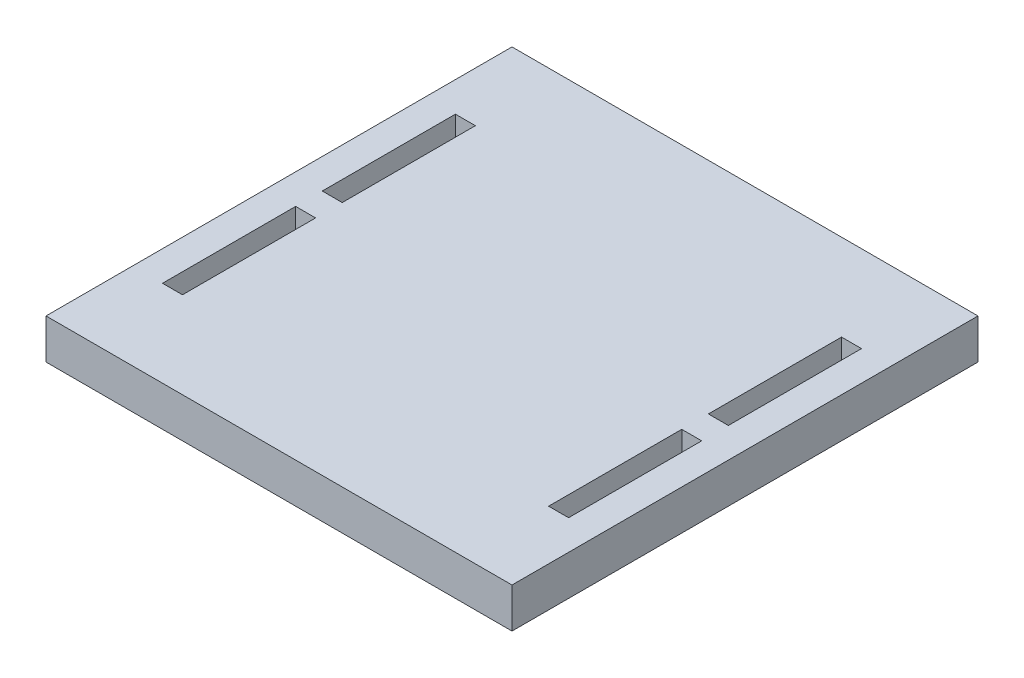
ISO-10303-21;
HEADER;
FILE_DESCRIPTION(('STEP AP214'),'2;1');
FILE_NAME('part.step','',(''),(''),'','','');
FILE_SCHEMA(('AUTOMOTIVE_DESIGN { 1 0 10303 214 1 1 1 1 }'));
ENDSEC;
DATA;
#1=APPLICATION_CONTEXT('core data for automotive mechanical design processes');
#2=APPLICATION_PROTOCOL_DEFINITION('international standard','automotive_design',2000,#1);
#3=PRODUCT_CONTEXT('',#1,'mechanical');
#4=PRODUCT('Part','Part','',(#3));
#5=PRODUCT_RELATED_PRODUCT_CATEGORY('part','',(#4));
#6=PRODUCT_DEFINITION_FORMATION('','',#4);
#7=PRODUCT_DEFINITION_CONTEXT('part definition',#1,'design');
#8=PRODUCT_DEFINITION('design','',#6,#7);
#9=PRODUCT_DEFINITION_SHAPE('','',#8);
#10=(LENGTH_UNIT() NAMED_UNIT(*) SI_UNIT(.MILLI.,.METRE.));
#11=(NAMED_UNIT(*) PLANE_ANGLE_UNIT() SI_UNIT($,.RADIAN.));
#12=(NAMED_UNIT(*) SI_UNIT($,.STERADIAN.) SOLID_ANGLE_UNIT());
#13=UNCERTAINTY_MEASURE_WITH_UNIT(LENGTH_MEASURE(1.E-05),#10,'distance_accuracy_value','');
#14=(GEOMETRIC_REPRESENTATION_CONTEXT(3) GLOBAL_UNCERTAINTY_ASSIGNED_CONTEXT((#13)) GLOBAL_UNIT_ASSIGNED_CONTEXT((#10,
#11,#12)) REPRESENTATION_CONTEXT('',''));
#15=CARTESIAN_POINT('',(0.,0.,0.));
#16=DIRECTION('',(0.,0.,1.));
#17=DIRECTION('',(1.,0.,0.));
#18=AXIS2_PLACEMENT_3D('',#15,#16,#17);
#19=CARTESIAN_POINT('',(0.,6.,37.));
#20=DIRECTION('',(0.,0.,1.));
#21=DIRECTION('',(1.,0.,0.));
#22=AXIS2_PLACEMENT_3D('',#19,#20,#21);
#23=PLANE('',#22);
#24=DIRECTION('',(-1.,0.,0.));
#25=VECTOR('',#24,1.);
#26=CARTESIAN_POINT('',(0.,0.,37.));
#27=LINE('',#26,#25);
#28=CARTESIAN_POINT('',(65.5,0.,37.));
#29=VERTEX_POINT('',#28);
#30=CARTESIAN_POINT('',(62.5,0.,37.));
#31=VERTEX_POINT('',#30);
#32=EDGE_CURVE('E289',#29,#31,#27,.T.);
#33=ORIENTED_EDGE('',*,*,#32,.F.);
#34=DIRECTION('',(0.,-1.,0.));
#35=VECTOR('',#34,1.);
#36=CARTESIAN_POINT('',(65.5,6.,37.));
#37=LINE('',#36,#35);
#38=CARTESIAN_POINT('',(65.5,6.,37.));
#39=VERTEX_POINT('',#38);
#40=EDGE_CURVE('E11',#39,#29,#37,.T.);
#41=ORIENTED_EDGE('',*,*,#40,.F.);
#42=DIRECTION('',(-1.,0.,0.));
#43=VECTOR('',#42,1.);
#44=CARTESIAN_POINT('',(0.,6.,37.));
#45=LINE('',#44,#43);
#46=CARTESIAN_POINT('',(62.5,6.,37.));
#47=VERTEX_POINT('',#46);
#48=EDGE_CURVE('E215',#39,#47,#45,.T.);
#49=ORIENTED_EDGE('',*,*,#48,.T.);
#50=DIRECTION('',(0.,-1.,0.));
#51=VECTOR('',#50,1.);
#52=CARTESIAN_POINT('',(62.5,6.,37.));
#53=LINE('',#52,#51);
#54=EDGE_CURVE('E138',#47,#31,#53,.T.);
#55=ORIENTED_EDGE('',*,*,#54,.T.);
#56=EDGE_LOOP('',(#33,#41,#49,#55));
#57=FACE_BOUND('',#56,.T.);
#58=ADVANCED_FACE('F47',(#57),#23,.T.);
#59=CARTESIAN_POINT('',(65.5,6.,0.));
#60=DIRECTION('',(-1.,0.,0.));
#61=DIRECTION('',(0.,0.,1.));
#62=AXIS2_PLACEMENT_3D('',#59,#60,#61);
#63=PLANE('',#62);
#64=DIRECTION('',(0.,0.,-1.));
#65=VECTOR('',#64,1.);
#66=CARTESIAN_POINT('',(65.5,0.,0.));
#67=LINE('',#66,#65);
#68=CARTESIAN_POINT('',(65.5,0.,57.));
#69=VERTEX_POINT('',#68);
#70=EDGE_CURVE('E203',#69,#29,#67,.T.);
#71=ORIENTED_EDGE('',*,*,#70,.F.);
#72=DIRECTION('',(0.,-1.,0.));
#73=VECTOR('',#72,1.);
#74=CARTESIAN_POINT('',(65.5,6.,57.));
#75=LINE('',#74,#73);
#76=CARTESIAN_POINT('',(65.5,6.,57.));
#77=VERTEX_POINT('',#76);
#78=EDGE_CURVE('E58',#77,#69,#75,.T.);
#79=ORIENTED_EDGE('',*,*,#78,.F.);
#80=DIRECTION('',(0.,0.,-1.));
#81=VECTOR('',#80,1.);
#82=CARTESIAN_POINT('',(65.5,6.,0.));
#83=LINE('',#82,#81);
#84=EDGE_CURVE('E201',#77,#39,#83,.T.);
#85=ORIENTED_EDGE('',*,*,#84,.T.);
#86=ORIENTED_EDGE('',*,*,#40,.T.);
#87=EDGE_LOOP('',(#71,#79,#85,#86));
#88=FACE_BOUND('',#87,.T.);
#89=ADVANCED_FACE('F199',(#88),#63,.T.);
#90=CARTESIAN_POINT('',(0.,6.,57.));
#91=DIRECTION('',(0.,0.,1.));
#92=DIRECTION('',(1.,0.,0.));
#93=AXIS2_PLACEMENT_3D('',#90,#91,#92);
#94=PLANE('',#93);
#95=DIRECTION('',(-1.,0.,0.));
#96=VECTOR('',#95,1.);
#97=CARTESIAN_POINT('',(0.,0.,57.));
#98=LINE('',#97,#96);
#99=CARTESIAN_POINT('',(62.5,0.,57.));
#100=VERTEX_POINT('',#99);
#101=EDGE_CURVE('E294',#69,#100,#98,.T.);
#102=ORIENTED_EDGE('',*,*,#101,.T.);
#103=DIRECTION('',(0.,-1.,0.));
#104=VECTOR('',#103,1.);
#105=CARTESIAN_POINT('',(62.5,6.,57.));
#106=LINE('',#105,#104);
#107=CARTESIAN_POINT('',(62.5,6.,57.));
#108=VERTEX_POINT('',#107);
#109=EDGE_CURVE('E207',#108,#100,#106,.T.);
#110=ORIENTED_EDGE('',*,*,#109,.F.);
#111=DIRECTION('',(-1.,0.,0.));
#112=VECTOR('',#111,1.);
#113=CARTESIAN_POINT('',(0.,6.,57.));
#114=LINE('',#113,#112);
#115=EDGE_CURVE('E210',#77,#108,#114,.T.);
#116=ORIENTED_EDGE('',*,*,#115,.F.);
#117=ORIENTED_EDGE('',*,*,#78,.T.);
#118=EDGE_LOOP('',(#102,#110,#116,#117));
#119=FACE_BOUND('',#118,.T.);
#120=ADVANCED_FACE('F211',(#119),#94,.F.);
#121=CARTESIAN_POINT('',(0.,6.,57.));
#122=DIRECTION('',(0.,0.,-1.));
#123=DIRECTION('',(-1.,0.,0.));
#124=AXIS2_PLACEMENT_3D('',#121,#122,#123);
#125=PLANE('',#124);
#126=DIRECTION('',(1.,0.,0.));
#127=VECTOR('',#126,1.);
#128=CARTESIAN_POINT('',(0.,0.,57.));
#129=LINE('',#128,#127);
#130=CARTESIAN_POINT('',(4.5,0.,57.));
#131=VERTEX_POINT('',#130);
#132=CARTESIAN_POINT('',(7.50000000000001,0.,57.));
#133=VERTEX_POINT('',#132);
#134=EDGE_CURVE('E273',#131,#133,#129,.T.);
#135=ORIENTED_EDGE('',*,*,#134,.F.);
#136=DIRECTION('',(0.,-1.,0.));
#137=VECTOR('',#136,1.);
#138=CARTESIAN_POINT('',(4.5,6.,57.));
#139=LINE('',#138,#137);
#140=CARTESIAN_POINT('',(4.5,6.,57.));
#141=VERTEX_POINT('',#140);
#142=EDGE_CURVE('E301',#141,#131,#139,.T.);
#143=ORIENTED_EDGE('',*,*,#142,.F.);
#144=DIRECTION('',(1.,0.,0.));
#145=VECTOR('',#144,1.);
#146=CARTESIAN_POINT('',(0.,6.,57.));
#147=LINE('',#146,#145);
#148=CARTESIAN_POINT('',(7.50000000000001,6.,57.));
#149=VERTEX_POINT('',#148);
#150=EDGE_CURVE('E411',#141,#149,#147,.T.);
#151=ORIENTED_EDGE('',*,*,#150,.T.);
#152=DIRECTION('',(0.,-1.,0.));
#153=VECTOR('',#152,1.);
#154=CARTESIAN_POINT('',(7.50000000000001,6.,57.));
#155=LINE('',#154,#153);
#156=EDGE_CURVE('E304',#149,#133,#155,.T.);
#157=ORIENTED_EDGE('',*,*,#156,.T.);
#158=EDGE_LOOP('',(#135,#143,#151,#157));
#159=FACE_BOUND('',#158,.T.);
#160=ADVANCED_FACE('F438',(#159),#125,.T.);
#161=CARTESIAN_POINT('',(4.50000000000001,6.,0.));
#162=DIRECTION('',(-1.,0.,0.));
#163=DIRECTION('',(0.,0.,1.));
#164=AXIS2_PLACEMENT_3D('',#161,#162,#163);
#165=PLANE('',#164);
#166=DIRECTION('',(0.,0.,-1.));
#167=VECTOR('',#166,1.);
#168=CARTESIAN_POINT('',(4.50000000000001,0.,0.));
#169=LINE('',#168,#167);
#170=CARTESIAN_POINT('',(4.50000000000001,0.,37.));
#171=VERTEX_POINT('',#170);
#172=EDGE_CURVE('E277',#131,#171,#169,.T.);
#173=ORIENTED_EDGE('',*,*,#172,.T.);
#174=DIRECTION('',(0.,-1.,0.));
#175=VECTOR('',#174,1.);
#176=CARTESIAN_POINT('',(4.50000000000001,6.,37.));
#177=LINE('',#176,#175);
#178=CARTESIAN_POINT('',(4.50000000000001,6.,37.));
#179=VERTEX_POINT('',#178);
#180=EDGE_CURVE('E311',#179,#171,#177,.T.);
#181=ORIENTED_EDGE('',*,*,#180,.F.);
#182=DIRECTION('',(0.,0.,-1.));
#183=VECTOR('',#182,1.);
#184=CARTESIAN_POINT('',(4.50000000000001,6.,0.));
#185=LINE('',#184,#183);
#186=EDGE_CURVE('E415',#141,#179,#185,.T.);
#187=ORIENTED_EDGE('',*,*,#186,.F.);
#188=ORIENTED_EDGE('',*,*,#142,.T.);
#189=EDGE_LOOP('',(#173,#181,#187,#188));
#190=FACE_BOUND('',#189,.T.);
#191=ADVANCED_FACE('F440',(#190),#165,.F.);
#192=CARTESIAN_POINT('',(0.,6.,37.));
#193=DIRECTION('',(0.,0.,-1.));
#194=DIRECTION('',(-1.,0.,0.));
#195=AXIS2_PLACEMENT_3D('',#192,#193,#194);
#196=PLANE('',#195);
#197=DIRECTION('',(1.,0.,0.));
#198=VECTOR('',#197,1.);
#199=CARTESIAN_POINT('',(0.,0.,37.));
#200=LINE('',#199,#198);
#201=CARTESIAN_POINT('',(7.50000000000001,0.,37.));
#202=VERTEX_POINT('',#201);
#203=EDGE_CURVE('E281',#171,#202,#200,.T.);
#204=ORIENTED_EDGE('',*,*,#203,.T.);
#205=DIRECTION('',(0.,-1.,0.));
#206=VECTOR('',#205,1.);
#207=CARTESIAN_POINT('',(7.50000000000001,6.,37.));
#208=LINE('',#207,#206);
#209=CARTESIAN_POINT('',(7.50000000000001,6.,37.));
#210=VERTEX_POINT('',#209);
#211=EDGE_CURVE('E307',#210,#202,#208,.T.);
#212=ORIENTED_EDGE('',*,*,#211,.F.);
#213=DIRECTION('',(1.,0.,0.));
#214=VECTOR('',#213,1.);
#215=CARTESIAN_POINT('',(0.,6.,37.));
#216=LINE('',#215,#214);
#217=EDGE_CURVE('E419',#179,#210,#216,.T.);
#218=ORIENTED_EDGE('',*,*,#217,.F.);
#219=ORIENTED_EDGE('',*,*,#180,.T.);
#220=EDGE_LOOP('',(#204,#212,#218,#219));
#221=FACE_BOUND('',#220,.T.);
#222=ADVANCED_FACE('F433',(#221),#196,.F.);
#223=CARTESIAN_POINT('',(0.,6.,13.));
#224=DIRECTION('',(0.,0.,1.));
#225=DIRECTION('',(1.,0.,0.));
#226=AXIS2_PLACEMENT_3D('',#223,#224,#225);
#227=PLANE('',#226);
#228=DIRECTION('',(-1.,0.,0.));
#229=VECTOR('',#228,1.);
#230=CARTESIAN_POINT('',(0.,0.,13.));
#231=LINE('',#230,#229);
#232=CARTESIAN_POINT('',(65.5,0.,13.));
#233=VERTEX_POINT('',#232);
#234=CARTESIAN_POINT('',(62.5,0.,13.));
#235=VERTEX_POINT('',#234);
#236=EDGE_CURVE('E257',#233,#235,#231,.T.);
#237=ORIENTED_EDGE('',*,*,#236,.F.);
#238=DIRECTION('',(0.,-1.,0.));
#239=VECTOR('',#238,1.);
#240=CARTESIAN_POINT('',(65.5,6.,13.));
#241=LINE('',#240,#239);
#242=CARTESIAN_POINT('',(65.5,6.,13.));
#243=VERTEX_POINT('',#242);
#244=EDGE_CURVE('E308',#243,#233,#241,.T.);
#245=ORIENTED_EDGE('',*,*,#244,.F.);
#246=DIRECTION('',(-1.,0.,0.));
#247=VECTOR('',#246,1.);
#248=CARTESIAN_POINT('',(0.,6.,13.));
#249=LINE('',#248,#247);
#250=CARTESIAN_POINT('',(62.5,6.,13.));
#251=VERTEX_POINT('',#250);
#252=EDGE_CURVE('E396',#243,#251,#249,.T.);
#253=ORIENTED_EDGE('',*,*,#252,.T.);
#254=DIRECTION('',(0.,-1.,0.));
#255=VECTOR('',#254,1.);
#256=CARTESIAN_POINT('',(62.5,6.,13.));
#257=LINE('',#256,#255);
#258=EDGE_CURVE('E317',#251,#235,#257,.T.);
#259=ORIENTED_EDGE('',*,*,#258,.T.);
#260=EDGE_LOOP('',(#237,#245,#253,#259));
#261=FACE_BOUND('',#260,.T.);
#262=ADVANCED_FACE('F447',(#261),#227,.T.);
#263=CARTESIAN_POINT('',(65.5,6.,0.));
#264=DIRECTION('',(1.,0.,0.));
#265=DIRECTION('',(0.,0.,-1.));
#266=AXIS2_PLACEMENT_3D('',#263,#264,#265);
#267=PLANE('',#266);
#268=DIRECTION('',(0.,0.,1.));
#269=VECTOR('',#268,1.);
#270=CARTESIAN_POINT('',(65.5,0.,0.));
#271=LINE('',#270,#269);
#272=CARTESIAN_POINT('',(65.5,0.,33.));
#273=VERTEX_POINT('',#272);
#274=EDGE_CURVE('E261',#233,#273,#271,.T.);
#275=ORIENTED_EDGE('',*,*,#274,.T.);
#276=DIRECTION('',(0.,-1.,0.));
#277=VECTOR('',#276,1.);
#278=CARTESIAN_POINT('',(65.5,6.,33.));
#279=LINE('',#278,#277);
#280=CARTESIAN_POINT('',(65.5,6.,33.));
#281=VERTEX_POINT('',#280);
#282=EDGE_CURVE('E324',#281,#273,#279,.T.);
#283=ORIENTED_EDGE('',*,*,#282,.F.);
#284=DIRECTION('',(0.,0.,1.));
#285=VECTOR('',#284,1.);
#286=CARTESIAN_POINT('',(65.5,6.,0.));
#287=LINE('',#286,#285);
#288=EDGE_CURVE('E400',#243,#281,#287,.T.);
#289=ORIENTED_EDGE('',*,*,#288,.F.);
#290=ORIENTED_EDGE('',*,*,#244,.T.);
#291=EDGE_LOOP('',(#275,#283,#289,#290));
#292=FACE_BOUND('',#291,.T.);
#293=ADVANCED_FACE('F493',(#292),#267,.F.);
#294=CARTESIAN_POINT('',(0.,6.,33.));
#295=DIRECTION('',(0.,0.,1.));
#296=DIRECTION('',(1.,0.,0.));
#297=AXIS2_PLACEMENT_3D('',#294,#295,#296);
#298=PLANE('',#297);
#299=DIRECTION('',(-1.,0.,0.));
#300=VECTOR('',#299,1.);
#301=CARTESIAN_POINT('',(0.,0.,33.));
#302=LINE('',#301,#300);
#303=CARTESIAN_POINT('',(62.5,0.,33.));
#304=VERTEX_POINT('',#303);
#305=EDGE_CURVE('E265',#273,#304,#302,.T.);
#306=ORIENTED_EDGE('',*,*,#305,.T.);
#307=DIRECTION('',(0.,-1.,0.));
#308=VECTOR('',#307,1.);
#309=CARTESIAN_POINT('',(62.5,6.,33.));
#310=LINE('',#309,#308);
#311=CARTESIAN_POINT('',(62.5,6.,33.));
#312=VERTEX_POINT('',#311);
#313=EDGE_CURVE('E320',#312,#304,#310,.T.);
#314=ORIENTED_EDGE('',*,*,#313,.F.);
#315=DIRECTION('',(-1.,0.,0.));
#316=VECTOR('',#315,1.);
#317=CARTESIAN_POINT('',(0.,6.,33.));
#318=LINE('',#317,#316);
#319=EDGE_CURVE('E404',#281,#312,#318,.T.);
#320=ORIENTED_EDGE('',*,*,#319,.F.);
#321=ORIENTED_EDGE('',*,*,#282,.T.);
#322=EDGE_LOOP('',(#306,#314,#320,#321));
#323=FACE_BOUND('',#322,.T.);
#324=ADVANCED_FACE('F479',(#323),#298,.F.);
#325=CARTESIAN_POINT('',(0.,6.,13.));
#326=DIRECTION('',(0.,0.,-1.));
#327=DIRECTION('',(-1.,0.,0.));
#328=AXIS2_PLACEMENT_3D('',#325,#326,#327);
#329=PLANE('',#328);
#330=DIRECTION('',(1.,0.,0.));
#331=VECTOR('',#330,1.);
#332=CARTESIAN_POINT('',(0.,0.,13.));
#333=LINE('',#332,#331);
#334=CARTESIAN_POINT('',(4.5,0.,13.));
#335=VERTEX_POINT('',#334);
#336=CARTESIAN_POINT('',(7.50000000000001,0.,13.));
#337=VERTEX_POINT('',#336);
#338=EDGE_CURVE('E241',#335,#337,#333,.T.);
#339=ORIENTED_EDGE('',*,*,#338,.T.);
#340=DIRECTION('',(0.,-1.,0.));
#341=VECTOR('',#340,1.);
#342=CARTESIAN_POINT('',(7.50000000000001,6.,13.));
#343=LINE('',#342,#341);
#344=CARTESIAN_POINT('',(7.50000000000001,6.,13.));
#345=VERTEX_POINT('',#344);
#346=EDGE_CURVE('E321',#345,#337,#343,.T.);
#347=ORIENTED_EDGE('',*,*,#346,.F.);
#348=DIRECTION('',(1.,0.,0.));
#349=VECTOR('',#348,1.);
#350=CARTESIAN_POINT('',(0.,6.,13.));
#351=LINE('',#350,#349);
#352=CARTESIAN_POINT('',(4.5,6.,13.));
#353=VERTEX_POINT('',#352);
#354=EDGE_CURVE('E373',#353,#345,#351,.T.);
#355=ORIENTED_EDGE('',*,*,#354,.F.);
#356=DIRECTION('',(0.,-1.,0.));
#357=VECTOR('',#356,1.);
#358=CARTESIAN_POINT('',(4.5,6.,13.));
#359=LINE('',#358,#357);
#360=EDGE_CURVE('E330',#353,#335,#359,.T.);
#361=ORIENTED_EDGE('',*,*,#360,.T.);
#362=EDGE_LOOP('',(#339,#347,#355,#361));
#363=FACE_BOUND('',#362,.T.);
#364=ADVANCED_FACE('F475',(#363),#329,.F.);
#365=CARTESIAN_POINT('',(7.5,6.,0.));
#366=DIRECTION('',(1.,0.,0.));
#367=DIRECTION('',(0.,0.,-1.));
#368=AXIS2_PLACEMENT_3D('',#365,#366,#367);
#369=PLANE('',#368);
#370=DIRECTION('',(0.,0.,1.));
#371=VECTOR('',#370,1.);
#372=CARTESIAN_POINT('',(7.5,0.,0.));
#373=LINE('',#372,#371);
#374=CARTESIAN_POINT('',(7.50000000000001,0.,33.));
#375=VERTEX_POINT('',#374);
#376=EDGE_CURVE('E245',#337,#375,#373,.T.);
#377=ORIENTED_EDGE('',*,*,#376,.T.);
#378=DIRECTION('',(0.,-1.,0.));
#379=VECTOR('',#378,1.);
#380=CARTESIAN_POINT('',(7.50000000000001,6.,33.));
#381=LINE('',#380,#379);
#382=CARTESIAN_POINT('',(7.50000000000001,6.,33.));
#383=VERTEX_POINT('',#382);
#384=EDGE_CURVE('E336',#383,#375,#381,.T.);
#385=ORIENTED_EDGE('',*,*,#384,.F.);
#386=DIRECTION('',(0.,0.,1.));
#387=VECTOR('',#386,1.);
#388=CARTESIAN_POINT('',(7.5,6.,0.));
#389=LINE('',#388,#387);
#390=EDGE_CURVE('E385',#345,#383,#389,.T.);
#391=ORIENTED_EDGE('',*,*,#390,.F.);
#392=ORIENTED_EDGE('',*,*,#346,.T.);
#393=EDGE_LOOP('',(#377,#385,#391,#392));
#394=FACE_BOUND('',#393,.T.);
#395=ADVANCED_FACE('F478',(#394),#369,.F.);
#396=CARTESIAN_POINT('',(0.,6.,33.));
#397=DIRECTION('',(0.,0.,-1.));
#398=DIRECTION('',(-1.,0.,0.));
#399=AXIS2_PLACEMENT_3D('',#396,#397,#398);
#400=PLANE('',#399);
#401=DIRECTION('',(1.,0.,0.));
#402=VECTOR('',#401,1.);
#403=CARTESIAN_POINT('',(0.,0.,33.));
#404=LINE('',#403,#402);
#405=CARTESIAN_POINT('',(4.50000000000001,0.,33.));
#406=VERTEX_POINT('',#405);
#407=EDGE_CURVE('E249',#406,#375,#404,.T.);
#408=ORIENTED_EDGE('',*,*,#407,.F.);
#409=DIRECTION('',(0.,-1.,0.));
#410=VECTOR('',#409,1.);
#411=CARTESIAN_POINT('',(4.50000000000001,6.,33.));
#412=LINE('',#411,#410);
#413=CARTESIAN_POINT('',(4.50000000000001,6.,33.));
#414=VERTEX_POINT('',#413);
#415=EDGE_CURVE('E333',#414,#406,#412,.T.);
#416=ORIENTED_EDGE('',*,*,#415,.F.);
#417=DIRECTION('',(1.,0.,0.));
#418=VECTOR('',#417,1.);
#419=CARTESIAN_POINT('',(0.,6.,33.));
#420=LINE('',#419,#418);
#421=EDGE_CURVE('E388',#414,#383,#420,.T.);
#422=ORIENTED_EDGE('',*,*,#421,.T.);
#423=ORIENTED_EDGE('',*,*,#384,.T.);
#424=EDGE_LOOP('',(#408,#416,#422,#423));
#425=FACE_BOUND('',#424,.T.);
#426=ADVANCED_FACE('F483',(#425),#400,.T.);
#427=CARTESIAN_POINT('',(0.,6.,70.));
#428=DIRECTION('',(0.,0.,-1.));
#429=DIRECTION('',(-1.,0.,0.));
#430=AXIS2_PLACEMENT_3D('',#427,#428,#429);
#431=PLANE('',#430);
#432=DIRECTION('',(1.,0.,0.));
#433=VECTOR('',#432,1.);
#434=CARTESIAN_POINT('',(0.,0.,70.));
#435=LINE('',#434,#433);
#436=CARTESIAN_POINT('',(0.,0.,70.));
#437=VERTEX_POINT('',#436);
#438=CARTESIAN_POINT('',(70.,0.,70.));
#439=VERTEX_POINT('',#438);
#440=EDGE_CURVE('E226',#437,#439,#435,.T.);
#441=ORIENTED_EDGE('',*,*,#440,.T.);
#442=DIRECTION('',(0.,-1.,0.));
#443=VECTOR('',#442,1.);
#444=CARTESIAN_POINT('',(70.,6.,70.));
#445=LINE('',#444,#443);
#446=CARTESIAN_POINT('',(70.,6.,70.));
#447=VERTEX_POINT('',#446);
#448=EDGE_CURVE('E51',#447,#439,#445,.T.);
#449=ORIENTED_EDGE('',*,*,#448,.F.);
#450=DIRECTION('',(1.,0.,0.));
#451=VECTOR('',#450,1.);
#452=CARTESIAN_POINT('',(0.,6.,70.));
#453=LINE('',#452,#451);
#454=CARTESIAN_POINT('',(0.,6.,70.));
#455=VERTEX_POINT('',#454);
#456=EDGE_CURVE('E146',#455,#447,#453,.T.);
#457=ORIENTED_EDGE('',*,*,#456,.F.);
#458=DIRECTION('',(0.,-1.,0.));
#459=VECTOR('',#458,1.);
#460=CARTESIAN_POINT('',(0.,6.,70.));
#461=LINE('',#460,#459);
#462=EDGE_CURVE('E225',#455,#437,#461,.T.);
#463=ORIENTED_EDGE('',*,*,#462,.T.);
#464=EDGE_LOOP('',(#441,#449,#457,#463));
#465=FACE_BOUND('',#464,.T.);
#466=ADVANCED_FACE('F49',(#465),#431,.F.);
#467=CARTESIAN_POINT('',(70.,6.,0.));
#468=DIRECTION('',(1.,0.,0.));
#469=DIRECTION('',(0.,0.,-1.));
#470=AXIS2_PLACEMENT_3D('',#467,#468,#469);
#471=PLANE('',#470);
#472=DIRECTION('',(0.,0.,1.));
#473=VECTOR('',#472,1.);
#474=CARTESIAN_POINT('',(70.,0.,0.));
#475=LINE('',#474,#473);
#476=CARTESIAN_POINT('',(70.,0.,0.));
#477=VERTEX_POINT('',#476);
#478=EDGE_CURVE('E230',#477,#439,#475,.T.);
#479=ORIENTED_EDGE('',*,*,#478,.F.);
#480=DIRECTION('',(0.,-1.,0.));
#481=VECTOR('',#480,1.);
#482=CARTESIAN_POINT('',(70.,6.,0.));
#483=LINE('',#482,#481);
#484=CARTESIAN_POINT('',(70.,6.,0.));
#485=VERTEX_POINT('',#484);
#486=EDGE_CURVE('E347',#485,#477,#483,.T.);
#487=ORIENTED_EDGE('',*,*,#486,.F.);
#488=DIRECTION('',(0.,0.,1.));
#489=VECTOR('',#488,1.);
#490=CARTESIAN_POINT('',(70.,6.,0.));
#491=LINE('',#490,#489);
#492=EDGE_CURVE('E357',#485,#447,#491,.T.);
#493=ORIENTED_EDGE('',*,*,#492,.T.);
#494=ORIENTED_EDGE('',*,*,#448,.T.);
#495=EDGE_LOOP('',(#479,#487,#493,#494));
#496=FACE_BOUND('',#495,.T.);
#497=ADVANCED_FACE('F356',(#496),#471,.T.);
#498=CARTESIAN_POINT('',(0.,6.,0.));
#499=DIRECTION('',(0.,0.,-1.));
#500=DIRECTION('',(-1.,0.,0.));
#501=AXIS2_PLACEMENT_3D('',#498,#499,#500);
#502=PLANE('',#501);
#503=DIRECTION('',(1.,0.,0.));
#504=VECTOR('',#503,1.);
#505=CARTESIAN_POINT('',(0.,0.,0.));
#506=LINE('',#505,#504);
#507=CARTESIAN_POINT('',(0.,0.,0.));
#508=VERTEX_POINT('',#507);
#509=EDGE_CURVE('E234',#508,#477,#506,.T.);
#510=ORIENTED_EDGE('',*,*,#509,.F.);
#511=DIRECTION('',(0.,-1.,0.));
#512=VECTOR('',#511,1.);
#513=CARTESIAN_POINT('',(0.,6.,0.));
#514=LINE('',#513,#512);
#515=CARTESIAN_POINT('',(0.,6.,0.));
#516=VERTEX_POINT('',#515);
#517=EDGE_CURVE('E345',#516,#508,#514,.T.);
#518=ORIENTED_EDGE('',*,*,#517,.F.);
#519=DIRECTION('',(1.,0.,0.));
#520=VECTOR('',#519,1.);
#521=CARTESIAN_POINT('',(0.,6.,0.));
#522=LINE('',#521,#520);
#523=EDGE_CURVE('E368',#516,#485,#522,.T.);
#524=ORIENTED_EDGE('',*,*,#523,.T.);
#525=ORIENTED_EDGE('',*,*,#486,.T.);
#526=EDGE_LOOP('',(#510,#518,#524,#525));
#527=FACE_BOUND('',#526,.T.);
#528=ADVANCED_FACE('F365',(#527),#502,.T.);
#529=CARTESIAN_POINT('',(7.50000000000001,6.,0.));
#530=DIRECTION('',(-1.,0.,0.));
#531=DIRECTION('',(0.,0.,1.));
#532=AXIS2_PLACEMENT_3D('',#529,#530,#531);
#533=PLANE('',#532);
#534=DIRECTION('',(0.,0.,-1.));
#535=VECTOR('',#534,1.);
#536=CARTESIAN_POINT('',(7.50000000000001,0.,0.));
#537=LINE('',#536,#535);
#538=EDGE_CURVE('E285',#133,#202,#537,.T.);
#539=ORIENTED_EDGE('',*,*,#538,.F.);
#540=ORIENTED_EDGE('',*,*,#156,.F.);
#541=DIRECTION('',(0.,0.,-1.));
#542=VECTOR('',#541,1.);
#543=CARTESIAN_POINT('',(7.50000000000001,6.,0.));
#544=LINE('',#543,#542);
#545=EDGE_CURVE('E219',#149,#210,#544,.T.);
#546=ORIENTED_EDGE('',*,*,#545,.T.);
#547=ORIENTED_EDGE('',*,*,#211,.T.);
#548=EDGE_LOOP('',(#539,#540,#546,#547));
#549=FACE_BOUND('',#548,.T.);
#550=ADVANCED_FACE('F426',(#549),#533,.T.);
#551=CARTESIAN_POINT('',(62.5,6.,0.));
#552=DIRECTION('',(1.,0.,0.));
#553=DIRECTION('',(0.,0.,-1.));
#554=AXIS2_PLACEMENT_3D('',#551,#552,#553);
#555=PLANE('',#554);
#556=DIRECTION('',(0.,0.,1.));
#557=VECTOR('',#556,1.);
#558=CARTESIAN_POINT('',(62.5,0.,0.));
#559=LINE('',#558,#557);
#560=EDGE_CURVE('E269',#235,#304,#559,.T.);
#561=ORIENTED_EDGE('',*,*,#560,.F.);
#562=ORIENTED_EDGE('',*,*,#258,.F.);
#563=DIRECTION('',(0.,0.,1.));
#564=VECTOR('',#563,1.);
#565=CARTESIAN_POINT('',(62.5,6.,0.));
#566=LINE('',#565,#564);
#567=EDGE_CURVE('E407',#251,#312,#566,.T.);
#568=ORIENTED_EDGE('',*,*,#567,.T.);
#569=ORIENTED_EDGE('',*,*,#313,.T.);
#570=EDGE_LOOP('',(#561,#562,#568,#569));
#571=FACE_BOUND('',#570,.T.);
#572=ADVANCED_FACE('F459',(#571),#555,.T.);
#573=CARTESIAN_POINT('',(4.5,6.,0.));
#574=DIRECTION('',(1.,0.,0.));
#575=DIRECTION('',(0.,0.,-1.));
#576=AXIS2_PLACEMENT_3D('',#573,#574,#575);
#577=PLANE('',#576);
#578=DIRECTION('',(0.,0.,1.));
#579=VECTOR('',#578,1.);
#580=CARTESIAN_POINT('',(4.5,0.,0.));
#581=LINE('',#580,#579);
#582=EDGE_CURVE('E253',#335,#406,#581,.T.);
#583=ORIENTED_EDGE('',*,*,#582,.F.);
#584=ORIENTED_EDGE('',*,*,#360,.F.);
#585=DIRECTION('',(0.,0.,1.));
#586=VECTOR('',#585,1.);
#587=CARTESIAN_POINT('',(4.5,6.,0.));
#588=LINE('',#587,#586);
#589=EDGE_CURVE('E392',#353,#414,#588,.T.);
#590=ORIENTED_EDGE('',*,*,#589,.T.);
#591=ORIENTED_EDGE('',*,*,#415,.T.);
#592=EDGE_LOOP('',(#583,#584,#590,#591));
#593=FACE_BOUND('',#592,.T.);
#594=ADVANCED_FACE('F464',(#593),#577,.T.);
#595=CARTESIAN_POINT('',(0.,6.,0.));
#596=DIRECTION('',(1.,0.,0.));
#597=DIRECTION('',(0.,0.,-1.));
#598=AXIS2_PLACEMENT_3D('',#595,#596,#597);
#599=PLANE('',#598);
#600=DIRECTION('',(0.,0.,1.));
#601=VECTOR('',#600,1.);
#602=CARTESIAN_POINT('',(0.,0.,0.));
#603=LINE('',#602,#601);
#604=EDGE_CURVE('E238',#508,#437,#603,.T.);
#605=ORIENTED_EDGE('',*,*,#604,.T.);
#606=ORIENTED_EDGE('',*,*,#462,.F.);
#607=DIRECTION('',(0.,0.,1.));
#608=VECTOR('',#607,1.);
#609=CARTESIAN_POINT('',(0.,6.,0.));
#610=LINE('',#609,#608);
#611=EDGE_CURVE('E370',#516,#455,#610,.T.);
#612=ORIENTED_EDGE('',*,*,#611,.F.);
#613=ORIENTED_EDGE('',*,*,#517,.T.);
#614=EDGE_LOOP('',(#605,#606,#612,#613));
#615=FACE_BOUND('',#614,.T.);
#616=ADVANCED_FACE('F371',(#615),#599,.F.);
#617=CARTESIAN_POINT('',(62.5,6.,0.));
#618=DIRECTION('',(-1.,0.,0.));
#619=DIRECTION('',(0.,0.,1.));
#620=AXIS2_PLACEMENT_3D('',#617,#618,#619);
#621=PLANE('',#620);
#622=DIRECTION('',(0.,0.,-1.));
#623=VECTOR('',#622,1.);
#624=CARTESIAN_POINT('',(62.5,0.,0.));
#625=LINE('',#624,#623);
#626=EDGE_CURVE('E131',#100,#31,#625,.T.);
#627=ORIENTED_EDGE('',*,*,#626,.T.);
#628=ORIENTED_EDGE('',*,*,#54,.F.);
#629=DIRECTION('',(0.,0.,-1.));
#630=VECTOR('',#629,1.);
#631=CARTESIAN_POINT('',(62.5,6.,0.));
#632=LINE('',#631,#630);
#633=EDGE_CURVE('E67',#108,#47,#632,.T.);
#634=ORIENTED_EDGE('',*,*,#633,.F.);
#635=ORIENTED_EDGE('',*,*,#109,.T.);
#636=EDGE_LOOP('',(#627,#628,#634,#635));
#637=FACE_BOUND('',#636,.T.);
#638=ADVANCED_FACE('F474',(#637),#621,.F.);
#639=CARTESIAN_POINT('',(0.,6.,0.));
#640=DIRECTION('',(0.,1.,0.));
#641=DIRECTION('',(0.,0.,1.));
#642=AXIS2_PLACEMENT_3D('',#639,#640,#641);
#643=PLANE('',#642);
#644=ORIENTED_EDGE('',*,*,#456,.T.);
#645=ORIENTED_EDGE('',*,*,#492,.F.);
#646=ORIENTED_EDGE('',*,*,#523,.F.);
#647=ORIENTED_EDGE('',*,*,#611,.T.);
#648=EDGE_LOOP('',(#644,#645,#646,#647));
#649=FACE_BOUND('',#648,.T.);
#650=ORIENTED_EDGE('',*,*,#354,.T.);
#651=ORIENTED_EDGE('',*,*,#390,.T.);
#652=ORIENTED_EDGE('',*,*,#421,.F.);
#653=ORIENTED_EDGE('',*,*,#589,.F.);
#654=EDGE_LOOP('',(#650,#651,#652,#653));
#655=FACE_BOUND('',#654,.T.);
#656=ORIENTED_EDGE('',*,*,#252,.F.);
#657=ORIENTED_EDGE('',*,*,#288,.T.);
#658=ORIENTED_EDGE('',*,*,#319,.T.);
#659=ORIENTED_EDGE('',*,*,#567,.F.);
#660=EDGE_LOOP('',(#656,#657,#658,#659));
#661=FACE_BOUND('',#660,.T.);
#662=ORIENTED_EDGE('',*,*,#150,.F.);
#663=ORIENTED_EDGE('',*,*,#186,.T.);
#664=ORIENTED_EDGE('',*,*,#217,.T.);
#665=ORIENTED_EDGE('',*,*,#545,.F.);
#666=EDGE_LOOP('',(#662,#663,#664,#665));
#667=FACE_BOUND('',#666,.T.);
#668=ORIENTED_EDGE('',*,*,#48,.F.);
#669=ORIENTED_EDGE('',*,*,#84,.F.);
#670=ORIENTED_EDGE('',*,*,#115,.T.);
#671=ORIENTED_EDGE('',*,*,#633,.T.);
#672=EDGE_LOOP('',(#668,#669,#670,#671));
#673=FACE_BOUND('',#672,.T.);
#674=ADVANCED_FACE('F214',(#649,#655,#661,#667,#673),#643,.T.);
#675=CARTESIAN_POINT('',(0.,0.,0.));
#676=DIRECTION('',(0.,1.,0.));
#677=DIRECTION('',(0.,0.,1.));
#678=AXIS2_PLACEMENT_3D('',#675,#676,#677);
#679=PLANE('',#678);
#680=ORIENTED_EDGE('',*,*,#440,.F.);
#681=ORIENTED_EDGE('',*,*,#604,.F.);
#682=ORIENTED_EDGE('',*,*,#509,.T.);
#683=ORIENTED_EDGE('',*,*,#478,.T.);
#684=EDGE_LOOP('',(#680,#681,#682,#683));
#685=FACE_BOUND('',#684,.T.);
#686=ORIENTED_EDGE('',*,*,#338,.F.);
#687=ORIENTED_EDGE('',*,*,#582,.T.);
#688=ORIENTED_EDGE('',*,*,#407,.T.);
#689=ORIENTED_EDGE('',*,*,#376,.F.);
#690=EDGE_LOOP('',(#686,#687,#688,#689));
#691=FACE_BOUND('',#690,.T.);
#692=ORIENTED_EDGE('',*,*,#236,.T.);
#693=ORIENTED_EDGE('',*,*,#560,.T.);
#694=ORIENTED_EDGE('',*,*,#305,.F.);
#695=ORIENTED_EDGE('',*,*,#274,.F.);
#696=EDGE_LOOP('',(#692,#693,#694,#695));
#697=FACE_BOUND('',#696,.T.);
#698=ORIENTED_EDGE('',*,*,#134,.T.);
#699=ORIENTED_EDGE('',*,*,#538,.T.);
#700=ORIENTED_EDGE('',*,*,#203,.F.);
#701=ORIENTED_EDGE('',*,*,#172,.F.);
#702=EDGE_LOOP('',(#698,#699,#700,#701));
#703=FACE_BOUND('',#702,.T.);
#704=ORIENTED_EDGE('',*,*,#32,.T.);
#705=ORIENTED_EDGE('',*,*,#626,.F.);
#706=ORIENTED_EDGE('',*,*,#101,.F.);
#707=ORIENTED_EDGE('',*,*,#70,.T.);
#708=EDGE_LOOP('',(#704,#705,#706,#707));
#709=FACE_BOUND('',#708,.T.);
#710=ADVANCED_FACE('F363',(#685,#691,#697,#703,#709),#679,.F.);
#711=CLOSED_SHELL('',(#58,#89,#120,#160,#191,#222,#262,#293,#324,#364,#395,#426,#466,#497,#528,
#550,#572,#594,#616,#638,#674,#710));
#712=MANIFOLD_SOLID_BREP('B2',#711);
#713=ADVANCED_BREP_SHAPE_REPRESENTATION('',(#18,#712),#14);
#714=SHAPE_DEFINITION_REPRESENTATION(#9,#713);
ENDSEC;
END-ISO-10303-21;
